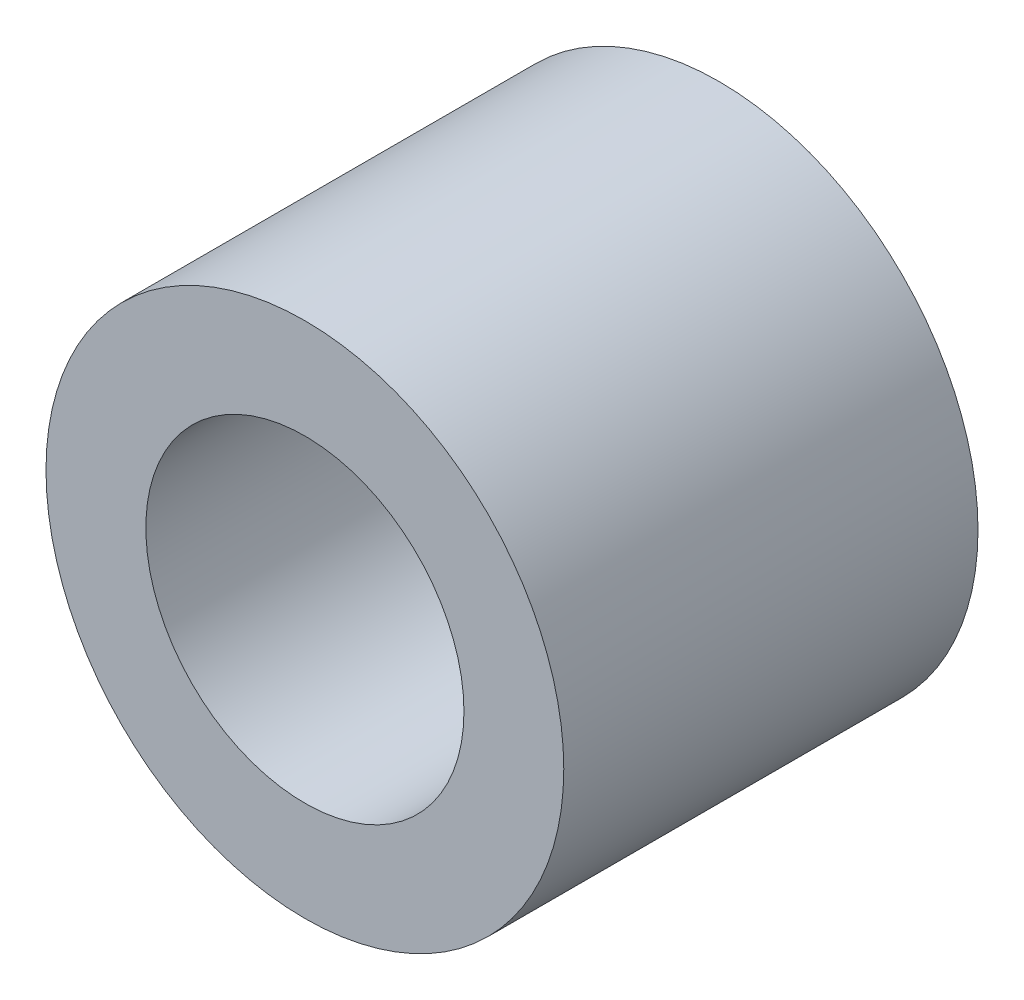
ISO-10303-21;
HEADER;
FILE_DESCRIPTION(('STEP AP214'),'2;1');
FILE_NAME('part.step','',(''),(''),'','','');
FILE_SCHEMA(('AUTOMOTIVE_DESIGN { 1 0 10303 214 1 1 1 1 }'));
ENDSEC;
DATA;
#1=APPLICATION_CONTEXT('core data for automotive mechanical design processes');
#2=APPLICATION_PROTOCOL_DEFINITION('international standard','automotive_design',2000,#1);
#3=PRODUCT_CONTEXT('',#1,'mechanical');
#4=PRODUCT('Part','Part','',(#3));
#5=PRODUCT_RELATED_PRODUCT_CATEGORY('part','',(#4));
#6=PRODUCT_DEFINITION_FORMATION('','',#4);
#7=PRODUCT_DEFINITION_CONTEXT('part definition',#1,'design');
#8=PRODUCT_DEFINITION('design','',#6,#7);
#9=PRODUCT_DEFINITION_SHAPE('','',#8);
#10=(LENGTH_UNIT() NAMED_UNIT(*) SI_UNIT(.MILLI.,.METRE.));
#11=(NAMED_UNIT(*) PLANE_ANGLE_UNIT() SI_UNIT($,.RADIAN.));
#12=(NAMED_UNIT(*) SI_UNIT($,.STERADIAN.) SOLID_ANGLE_UNIT());
#13=UNCERTAINTY_MEASURE_WITH_UNIT(LENGTH_MEASURE(1.E-05),#10,'distance_accuracy_value','');
#14=(GEOMETRIC_REPRESENTATION_CONTEXT(3) GLOBAL_UNCERTAINTY_ASSIGNED_CONTEXT((#13)) GLOBAL_UNIT_ASSIGNED_CONTEXT((#10,
#11,#12)) REPRESENTATION_CONTEXT('',''));
#15=CARTESIAN_POINT('',(0.,0.,0.));
#16=DIRECTION('',(0.,0.,1.));
#17=DIRECTION('',(1.,0.,0.));
#18=AXIS2_PLACEMENT_3D('',#15,#16,#17);
#19=CARTESIAN_POINT('',(0.,0.,0.));
#20=DIRECTION('',(0.,0.,1.));
#21=DIRECTION('',(1.,0.,0.));
#22=AXIS2_PLACEMENT_3D('',#19,#20,#21);
#23=CYLINDRICAL_SURFACE('',#22,2.4384);
#24=CARTESIAN_POINT('',(0.,0.,0.));
#25=DIRECTION('',(0.,0.,1.));
#26=DIRECTION('',(1.,0.,0.));
#27=AXIS2_PLACEMENT_3D('',#24,#25,#26);
#28=CIRCLE('',#27,2.4384);
#29=CARTESIAN_POINT('',(2.4384,0.,0.));
#30=VERTEX_POINT('',#29);
#31=EDGE_CURVE('E18',#30,#30,#28,.F.);
#32=ORIENTED_EDGE('',*,*,#31,.T.);
#33=EDGE_LOOP('',(#32));
#34=FACE_BOUND('',#33,.T.);
#35=CARTESIAN_POINT('',(0.,0.,6.34999999963));
#36=DIRECTION('',(0.,0.,1.));
#37=DIRECTION('',(1.,0.,0.));
#38=AXIS2_PLACEMENT_3D('',#35,#36,#37);
#39=CIRCLE('',#38,2.4384);
#40=CARTESIAN_POINT('',(2.4384,0.,6.34999999963));
#41=VERTEX_POINT('',#40);
#42=EDGE_CURVE('E27',#41,#41,#39,.F.);
#43=ORIENTED_EDGE('',*,*,#42,.F.);
#44=EDGE_LOOP('',(#43));
#45=FACE_BOUND('',#44,.T.);
#46=ADVANCED_FACE('F15',(#34,#45),#23,.F.);
#47=CARTESIAN_POINT('',(0.,0.,0.));
#48=DIRECTION('',(0.,0.,1.));
#49=DIRECTION('',(1.,0.,0.));
#50=AXIS2_PLACEMENT_3D('',#47,#48,#49);
#51=PLANE('',#50);
#52=ORIENTED_EDGE('',*,*,#31,.F.);
#53=EDGE_LOOP('',(#52));
#54=FACE_BOUND('',#53,.T.);
#55=CARTESIAN_POINT('',(0.,0.,0.));
#56=DIRECTION('',(0.,0.,1.));
#57=DIRECTION('',(1.,0.,0.));
#58=AXIS2_PLACEMENT_3D('',#55,#56,#57);
#59=CIRCLE('',#58,3.96875);
#60=CARTESIAN_POINT('',(3.96875,0.,0.));
#61=VERTEX_POINT('',#60);
#62=EDGE_CURVE('E22',#61,#61,#59,.T.);
#63=ORIENTED_EDGE('',*,*,#62,.F.);
#64=EDGE_LOOP('',(#63));
#65=FACE_BOUND('',#64,.T.);
#66=ADVANCED_FACE('F37',(#54,#65),#51,.F.);
#67=CARTESIAN_POINT('',(0.,0.,6.35));
#68=DIRECTION('',(0.,0.,1.));
#69=DIRECTION('',(1.,0.,0.));
#70=AXIS2_PLACEMENT_3D('',#67,#68,#69);
#71=PLANE('',#70);
#72=ORIENTED_EDGE('',*,*,#42,.T.);
#73=EDGE_LOOP('',(#72));
#74=FACE_BOUND('',#73,.T.);
#75=CARTESIAN_POINT('',(0.,0.,6.34999999963));
#76=DIRECTION('',(0.,0.,1.));
#77=DIRECTION('',(1.,0.,0.));
#78=AXIS2_PLACEMENT_3D('',#75,#76,#77);
#79=CIRCLE('',#78,3.96875);
#80=CARTESIAN_POINT('',(3.96875,0.,6.34999999963));
#81=VERTEX_POINT('',#80);
#82=EDGE_CURVE('E10',#81,#81,#79,.F.);
#83=ORIENTED_EDGE('',*,*,#82,.F.);
#84=EDGE_LOOP('',(#83));
#85=FACE_BOUND('',#84,.T.);
#86=ADVANCED_FACE('F40',(#74,#85),#71,.T.);
#87=CARTESIAN_POINT('',(0.,0.,0.));
#88=DIRECTION('',(0.,0.,1.));
#89=DIRECTION('',(1.,0.,0.));
#90=AXIS2_PLACEMENT_3D('',#87,#88,#89);
#91=CYLINDRICAL_SURFACE('',#90,3.96875);
#92=ORIENTED_EDGE('',*,*,#62,.T.);
#93=EDGE_LOOP('',(#92));
#94=FACE_BOUND('',#93,.T.);
#95=ORIENTED_EDGE('',*,*,#82,.T.);
#96=EDGE_LOOP('',(#95));
#97=FACE_BOUND('',#96,.T.);
#98=ADVANCED_FACE('F43',(#94,#97),#91,.T.);
#99=CLOSED_SHELL('',(#46,#66,#86,#98));
#100=MANIFOLD_SOLID_BREP('B1',#99);
#101=ADVANCED_BREP_SHAPE_REPRESENTATION('',(#18,#100),#14);
#102=SHAPE_DEFINITION_REPRESENTATION(#9,#101);
ENDSEC;
END-ISO-10303-21;
